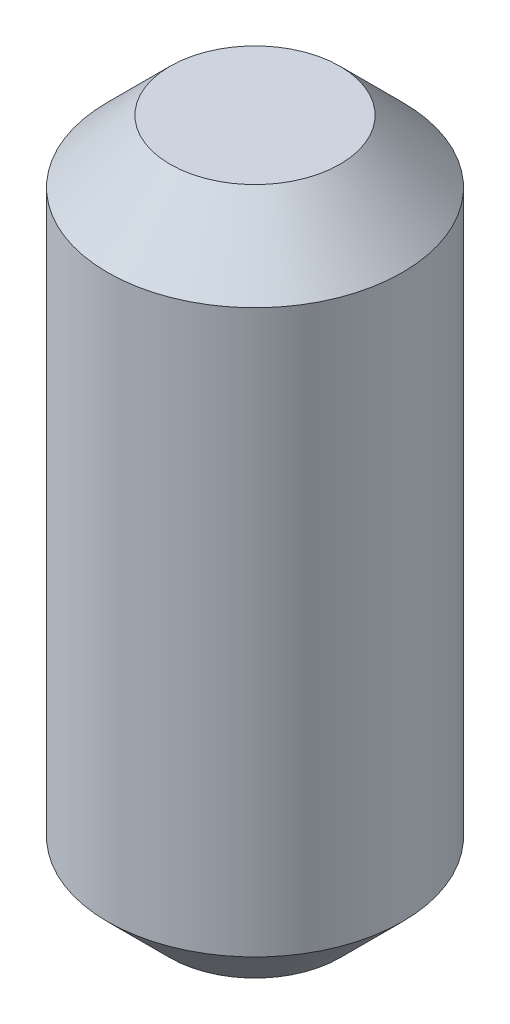
ISO-10303-21;
HEADER;
FILE_DESCRIPTION(('STEP AP214'),'2;1');
FILE_NAME('part.step','',(''),(''),'','','');
FILE_SCHEMA(('AUTOMOTIVE_DESIGN { 1 0 10303 214 1 1 1 1 }'));
ENDSEC;
DATA;
#1=APPLICATION_CONTEXT('core data for automotive mechanical design processes');
#2=APPLICATION_PROTOCOL_DEFINITION('international standard','automotive_design',2000,#1);
#3=PRODUCT_CONTEXT('',#1,'mechanical');
#4=PRODUCT('Part','Part','',(#3));
#5=PRODUCT_RELATED_PRODUCT_CATEGORY('part','',(#4));
#6=PRODUCT_DEFINITION_FORMATION('','',#4);
#7=PRODUCT_DEFINITION_CONTEXT('part definition',#1,'design');
#8=PRODUCT_DEFINITION('design','',#6,#7);
#9=PRODUCT_DEFINITION_SHAPE('','',#8);
#10=(LENGTH_UNIT() NAMED_UNIT(*) SI_UNIT(.MILLI.,.METRE.));
#11=(NAMED_UNIT(*) PLANE_ANGLE_UNIT() SI_UNIT($,.RADIAN.));
#12=(NAMED_UNIT(*) SI_UNIT($,.STERADIAN.) SOLID_ANGLE_UNIT());
#13=UNCERTAINTY_MEASURE_WITH_UNIT(LENGTH_MEASURE(1.E-05),#10,'distance_accuracy_value','');
#14=(GEOMETRIC_REPRESENTATION_CONTEXT(3) GLOBAL_UNCERTAINTY_ASSIGNED_CONTEXT((#13)) GLOBAL_UNIT_ASSIGNED_CONTEXT((#10,
#11,#12)) REPRESENTATION_CONTEXT('',''));
#15=CARTESIAN_POINT('',(0.,0.,0.));
#16=DIRECTION('',(0.,0.,1.));
#17=DIRECTION('',(1.,0.,0.));
#18=AXIS2_PLACEMENT_3D('',#15,#16,#17);
#19=CARTESIAN_POINT('',(0.,13.97,0.));
#20=DIRECTION('',(0.,-1.,0.));
#21=DIRECTION('',(0.,0.,-1.));
#22=AXIS2_PLACEMENT_3D('',#19,#20,#21);
#23=CYLINDRICAL_SURFACE('',#22,2.9972);
#24=CARTESIAN_POINT('',(0.,12.7,0.));
#25=DIRECTION('',(0.,1.,0.));
#26=DIRECTION('',(0.,0.,1.));
#27=AXIS2_PLACEMENT_3D('',#24,#25,#26);
#28=CIRCLE('',#27,2.9972);
#29=CARTESIAN_POINT('',(0.,12.7,2.9972));
#30=VERTEX_POINT('',#29);
#31=EDGE_CURVE('E50',#30,#30,#28,.F.);
#32=ORIENTED_EDGE('',*,*,#31,.T.);
#33=EDGE_LOOP('',(#32));
#34=FACE_BOUND('',#33,.T.);
#35=CARTESIAN_POINT('',(0.,1.27,0.));
#36=DIRECTION('',(0.,1.,0.));
#37=DIRECTION('',(0.,0.,1.));
#38=AXIS2_PLACEMENT_3D('',#35,#36,#37);
#39=CIRCLE('',#38,2.9972);
#40=CARTESIAN_POINT('',(0.,1.27,2.9972));
#41=VERTEX_POINT('',#40);
#42=EDGE_CURVE('E51',#41,#41,#39,.T.);
#43=ORIENTED_EDGE('',*,*,#42,.T.);
#44=EDGE_LOOP('',(#43));
#45=FACE_BOUND('',#44,.T.);
#46=ADVANCED_FACE('F39',(#34,#45),#23,.T.);
#47=CARTESIAN_POINT('',(0.,13.97,0.));
#48=DIRECTION('',(0.,1.,0.));
#49=DIRECTION('',(0.,0.,1.));
#50=AXIS2_PLACEMENT_3D('',#47,#48,#49);
#51=PLANE('',#50);
#52=CARTESIAN_POINT('',(0.,13.97,0.));
#53=DIRECTION('',(0.,1.,0.));
#54=DIRECTION('',(0.,0.,1.));
#55=AXIS2_PLACEMENT_3D('',#52,#53,#54);
#56=CIRCLE('',#55,1.7272);
#57=CARTESIAN_POINT('',(0.,13.97,1.7272));
#58=VERTEX_POINT('',#57);
#59=EDGE_CURVE('E54',#58,#58,#56,.T.);
#60=ORIENTED_EDGE('',*,*,#59,.T.);
#61=EDGE_LOOP('',(#60));
#62=FACE_BOUND('',#61,.T.);
#63=ADVANCED_FACE('F64',(#62),#51,.T.);
#64=CARTESIAN_POINT('',(0.,0.,0.));
#65=DIRECTION('',(0.,1.,0.));
#66=DIRECTION('',(0.,0.,1.));
#67=AXIS2_PLACEMENT_3D('',#64,#65,#66);
#68=PLANE('',#67);
#69=CARTESIAN_POINT('',(0.,0.,0.));
#70=DIRECTION('',(0.,1.,0.));
#71=DIRECTION('',(0.,0.,1.));
#72=AXIS2_PLACEMENT_3D('',#69,#70,#71);
#73=CIRCLE('',#72,1.72719999999999);
#74=CARTESIAN_POINT('',(0.,0.,1.72719999999999));
#75=VERTEX_POINT('',#74);
#76=EDGE_CURVE('E10',#75,#75,#73,.F.);
#77=ORIENTED_EDGE('',*,*,#76,.T.);
#78=EDGE_LOOP('',(#77));
#79=FACE_BOUND('',#78,.T.);
#80=ADVANCED_FACE('F62',(#79),#68,.F.);
#81=CARTESIAN_POINT('',(0.,13.97,0.));
#82=DIRECTION('',(0.,-1.,0.));
#83=DIRECTION('',(0.,0.,-1.));
#84=AXIS2_PLACEMENT_3D('',#81,#82,#83);
#85=CONICAL_SURFACE('',#84,1.7272,0.785398163397446);
#86=ORIENTED_EDGE('',*,*,#31,.F.);
#87=EDGE_LOOP('',(#86));
#88=FACE_BOUND('',#87,.T.);
#89=ORIENTED_EDGE('',*,*,#59,.F.);
#90=EDGE_LOOP('',(#89));
#91=FACE_BOUND('',#90,.T.);
#92=ADVANCED_FACE('F65',(#88,#91),#85,.T.);
#93=CARTESIAN_POINT('',(0.,1.27,0.));
#94=DIRECTION('',(0.,1.,0.));
#95=DIRECTION('',(0.,0.,1.));
#96=AXIS2_PLACEMENT_3D('',#93,#94,#95);
#97=CONICAL_SURFACE('',#96,2.9972,0.78539816339745);
#98=ORIENTED_EDGE('',*,*,#76,.F.);
#99=EDGE_LOOP('',(#98));
#100=FACE_BOUND('',#99,.T.);
#101=ORIENTED_EDGE('',*,*,#42,.F.);
#102=EDGE_LOOP('',(#101));
#103=FACE_BOUND('',#102,.T.);
#104=ADVANCED_FACE('F45',(#100,#103),#97,.T.);
#105=CLOSED_SHELL('',(#46,#63,#80,#92,#104));
#106=MANIFOLD_SOLID_BREP('B2',#105);
#107=ADVANCED_BREP_SHAPE_REPRESENTATION('',(#18,#106),#14);
#108=SHAPE_DEFINITION_REPRESENTATION(#9,#107);
ENDSEC;
END-ISO-10303-21;
